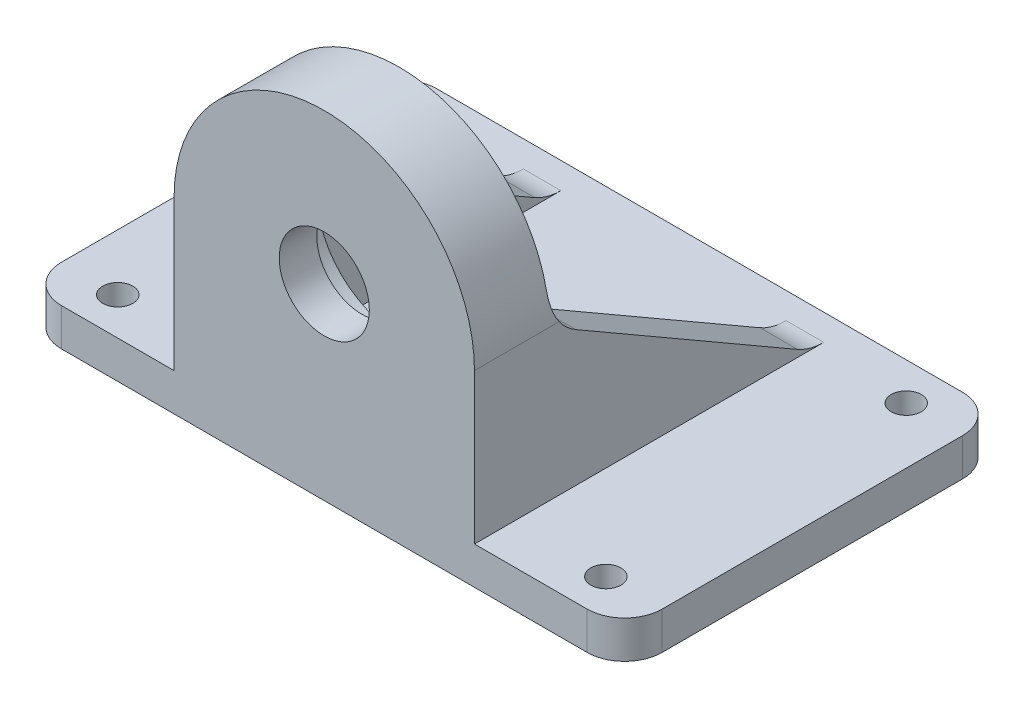
ISO-10303-21;
HEADER;
FILE_DESCRIPTION(('STEP AP214'),'2;1');
FILE_NAME('part.step','',(''),(''),'','','');
FILE_SCHEMA(('AUTOMOTIVE_DESIGN { 1 0 10303 214 1 1 1 1 }'));
ENDSEC;
DATA;
#1=APPLICATION_CONTEXT('core data for automotive mechanical design processes');
#2=APPLICATION_PROTOCOL_DEFINITION('international standard','automotive_design',2000,#1);
#3=PRODUCT_CONTEXT('',#1,'mechanical');
#4=PRODUCT('Part','Part','',(#3));
#5=PRODUCT_RELATED_PRODUCT_CATEGORY('part','',(#4));
#6=PRODUCT_DEFINITION_FORMATION('','',#4);
#7=PRODUCT_DEFINITION_CONTEXT('part definition',#1,'design');
#8=PRODUCT_DEFINITION('design','',#6,#7);
#9=PRODUCT_DEFINITION_SHAPE('','',#8);
#10=(LENGTH_UNIT() NAMED_UNIT(*) SI_UNIT(.MILLI.,.METRE.));
#11=(NAMED_UNIT(*) PLANE_ANGLE_UNIT() SI_UNIT($,.RADIAN.));
#12=(NAMED_UNIT(*) SI_UNIT($,.STERADIAN.) SOLID_ANGLE_UNIT());
#13=UNCERTAINTY_MEASURE_WITH_UNIT(LENGTH_MEASURE(1.E-05),#10,'distance_accuracy_value','');
#14=(GEOMETRIC_REPRESENTATION_CONTEXT(3) GLOBAL_UNCERTAINTY_ASSIGNED_CONTEXT((#13)) GLOBAL_UNIT_ASSIGNED_CONTEXT((#10,
#11,#12)) REPRESENTATION_CONTEXT('',''));
#15=CARTESIAN_POINT('',(0.,0.,0.));
#16=DIRECTION('',(0.,0.,1.));
#17=DIRECTION('',(1.,0.,0.));
#18=AXIS2_PLACEMENT_3D('',#15,#16,#17);
#19=CARTESIAN_POINT('',(0.,25.,15.));
#20=DIRECTION('',(0.,0.,1.));
#21=DIRECTION('',(1.,0.,0.));
#22=AXIS2_PLACEMENT_3D('',#19,#20,#21);
#23=PLANE('',#22);
#24=CARTESIAN_POINT('',(0.,25.,15.));
#25=DIRECTION('',(0.,0.,1.));
#26=DIRECTION('',(1.,0.,0.));
#27=AXIS2_PLACEMENT_3D('',#24,#25,#26);
#28=CIRCLE('',#27,11.);
#29=CARTESIAN_POINT('',(11.,25.,15.));
#30=VERTEX_POINT('',#29);
#31=EDGE_CURVE('E213',#30,#30,#28,.T.);
#32=ORIENTED_EDGE('',*,*,#31,.T.);
#33=EDGE_LOOP('',(#32));
#34=FACE_BOUND('',#33,.T.);
#35=DIRECTION('',(0.,1.,0.));
#36=VECTOR('',#35,1.);
#37=CARTESIAN_POINT('',(15.,5.,15.));
#38=LINE('',#37,#36);
#39=CARTESIAN_POINT('',(15.,12.,15.));
#40=VERTEX_POINT('',#39);
#41=CARTESIAN_POINT('',(15.,29.0414518843274,15.));
#42=VERTEX_POINT('',#41);
#43=EDGE_CURVE('E774',#40,#42,#38,.T.);
#44=ORIENTED_EDGE('',*,*,#43,.F.);
#45=DIRECTION('',(1.,0.,0.));
#46=VECTOR('',#45,1.);
#47=CARTESIAN_POINT('',(-15.,12.,15.));
#48=LINE('',#47,#46);
#49=CARTESIAN_POINT('',(-15.,12.,15.));
#50=VERTEX_POINT('',#49);
#51=EDGE_CURVE('E287',#40,#50,#48,.F.);
#52=ORIENTED_EDGE('',*,*,#51,.T.);
#53=DIRECTION('',(0.,1.,0.));
#54=VECTOR('',#53,1.);
#55=CARTESIAN_POINT('',(-15.,5.,15.));
#56=LINE('',#55,#54);
#57=CARTESIAN_POINT('',(-15.,29.0414518843274,15.));
#58=VERTEX_POINT('',#57);
#59=EDGE_CURVE('E518',#50,#58,#56,.T.);
#60=ORIENTED_EDGE('',*,*,#59,.T.);
#61=DIRECTION('',(-1.,0.,0.));
#62=VECTOR('',#61,1.);
#63=CARTESIAN_POINT('',(0.,29.0414518843274,15.));
#64=LINE('',#63,#62);
#65=CARTESIAN_POINT('',(-19.5874109230053,29.0414518843274,15.));
#66=VERTEX_POINT('',#65);
#67=EDGE_CURVE('E279',#58,#66,#64,.T.);
#68=ORIENTED_EDGE('',*,*,#67,.T.);
#69=CARTESIAN_POINT('',(0.,25.,15.));
#70=DIRECTION('',(0.,0.,1.));
#71=DIRECTION('',(1.,0.,0.));
#72=AXIS2_PLACEMENT_3D('',#69,#70,#71);
#73=CIRCLE('',#72,20.);
#74=CARTESIAN_POINT('',(19.5874109230053,29.0414518843274,15.));
#75=VERTEX_POINT('',#74);
#76=EDGE_CURVE('E196',#75,#66,#73,.T.);
#77=ORIENTED_EDGE('',*,*,#76,.F.);
#78=DIRECTION('',(1.,0.,0.));
#79=VECTOR('',#78,1.);
#80=CARTESIAN_POINT('',(15.,29.0414518843274,15.));
#81=LINE('',#80,#79);
#82=EDGE_CURVE('E283',#75,#42,#81,.F.);
#83=ORIENTED_EDGE('',*,*,#82,.T.);
#84=EDGE_LOOP('',(#44,#52,#60,#68,#77,#83));
#85=FACE_BOUND('',#84,.T.);
#86=ADVANCED_FACE('F39',(#34,#85),#23,.F.);
#87=CARTESIAN_POINT('',(0.,25.,15.));
#88=DIRECTION('',(0.,0.,1.));
#89=DIRECTION('',(1.,0.,0.));
#90=AXIS2_PLACEMENT_3D('',#87,#88,#89);
#91=CYLINDRICAL_SURFACE('',#90,11.);
#92=ORIENTED_EDGE('',*,*,#31,.F.);
#93=EDGE_LOOP('',(#92));
#94=FACE_BOUND('',#93,.T.);
#95=CARTESIAN_POINT('',(0.,25.,20.));
#96=DIRECTION('',(0.,0.,1.));
#97=DIRECTION('',(1.,0.,0.));
#98=AXIS2_PLACEMENT_3D('',#95,#96,#97);
#99=CIRCLE('',#98,11.);
#100=CARTESIAN_POINT('',(11.,25.,20.));
#101=VERTEX_POINT('',#100);
#102=EDGE_CURVE('E248',#101,#101,#99,.F.);
#103=ORIENTED_EDGE('',*,*,#102,.F.);
#104=EDGE_LOOP('',(#103));
#105=FACE_BOUND('',#104,.T.);
#106=ADVANCED_FACE('F374',(#94,#105),#91,.F.);
#107=CARTESIAN_POINT('',(0.,5.,0.));
#108=DIRECTION('',(0.,-1.,0.));
#109=DIRECTION('',(0.,0.,-1.));
#110=AXIS2_PLACEMENT_3D('',#107,#108,#109);
#111=PLANE('',#110);
#112=CARTESIAN_POINT('',(32.5,5.,20.));
#113=DIRECTION('',(0.,-1.,0.));
#114=DIRECTION('',(0.,0.,-1.));
#115=AXIS2_PLACEMENT_3D('',#112,#113,#114);
#116=CIRCLE('',#115,2.);
#117=CARTESIAN_POINT('',(32.5,5.,18.));
#118=VERTEX_POINT('',#117);
#119=EDGE_CURVE('E796',#118,#118,#116,.T.);
#120=ORIENTED_EDGE('',*,*,#119,.T.);
#121=EDGE_LOOP('',(#120));
#122=FACE_BOUND('',#121,.T.);
#123=CARTESIAN_POINT('',(32.5,5.,-20.));
#124=DIRECTION('',(0.,-1.,0.));
#125=DIRECTION('',(0.,0.,-1.));
#126=AXIS2_PLACEMENT_3D('',#123,#124,#125);
#127=CIRCLE('',#126,2.);
#128=CARTESIAN_POINT('',(32.5,5.,-22.));
#129=VERTEX_POINT('',#128);
#130=EDGE_CURVE('E804',#129,#129,#127,.T.);
#131=ORIENTED_EDGE('',*,*,#130,.T.);
#132=EDGE_LOOP('',(#131));
#133=FACE_BOUND('',#132,.T.);
#134=CARTESIAN_POINT('',(-32.5,5.,-20.));
#135=DIRECTION('',(0.,-1.,0.));
#136=DIRECTION('',(0.,0.,-1.));
#137=AXIS2_PLACEMENT_3D('',#134,#135,#136);
#138=CIRCLE('',#137,2.);
#139=CARTESIAN_POINT('',(-32.5,5.,-22.));
#140=VERTEX_POINT('',#139);
#141=EDGE_CURVE('E788',#140,#140,#138,.T.);
#142=ORIENTED_EDGE('',*,*,#141,.T.);
#143=EDGE_LOOP('',(#142));
#144=FACE_BOUND('',#143,.T.);
#145=CARTESIAN_POINT('',(-32.5,5.,20.));
#146=DIRECTION('',(0.,-1.,0.));
#147=DIRECTION('',(0.,0.,-1.));
#148=AXIS2_PLACEMENT_3D('',#145,#146,#147);
#149=CIRCLE('',#148,2.);
#150=CARTESIAN_POINT('',(-32.5,5.,18.));
#151=VERTEX_POINT('',#150);
#152=EDGE_CURVE('E780',#151,#151,#149,.T.);
#153=ORIENTED_EDGE('',*,*,#152,.T.);
#154=EDGE_LOOP('',(#153));
#155=FACE_BOUND('',#154,.T.);
#156=DIRECTION('',(1.,0.,0.));
#157=VECTOR('',#156,1.);
#158=CARTESIAN_POINT('',(-40.,5.,25.));
#159=LINE('',#158,#157);
#160=CARTESIAN_POINT('',(20.,5.,25.));
#161=VERTEX_POINT('',#160);
#162=CARTESIAN_POINT('',(35.,5.,25.));
#163=VERTEX_POINT('',#162);
#164=EDGE_CURVE('E244',#161,#163,#159,.T.);
#165=ORIENTED_EDGE('',*,*,#164,.T.);
#166=CARTESIAN_POINT('',(35.,5.,20.));
#167=DIRECTION('',(0.,-1.,0.));
#168=DIRECTION('',(0.,0.,-1.));
#169=AXIS2_PLACEMENT_3D('',#166,#167,#168);
#170=CIRCLE('',#169,5.);
#171=CARTESIAN_POINT('',(40.,5.,20.));
#172=VERTEX_POINT('',#171);
#173=EDGE_CURVE('E460',#163,#172,#170,.F.);
#174=ORIENTED_EDGE('',*,*,#173,.T.);
#175=DIRECTION('',(0.,0.,-1.));
#176=VECTOR('',#175,1.);
#177=CARTESIAN_POINT('',(40.,5.,25.));
#178=LINE('',#177,#176);
#179=CARTESIAN_POINT('',(40.,5.,-20.));
#180=VERTEX_POINT('',#179);
#181=EDGE_CURVE('E233',#172,#180,#178,.T.);
#182=ORIENTED_EDGE('',*,*,#181,.T.);
#183=CARTESIAN_POINT('',(35.,5.,-20.));
#184=DIRECTION('',(0.,-1.,0.));
#185=DIRECTION('',(0.,0.,-1.));
#186=AXIS2_PLACEMENT_3D('',#183,#184,#185);
#187=CIRCLE('',#186,5.);
#188=CARTESIAN_POINT('',(35.,5.,-25.));
#189=VERTEX_POINT('',#188);
#190=EDGE_CURVE('E452',#180,#189,#187,.F.);
#191=ORIENTED_EDGE('',*,*,#190,.T.);
#192=DIRECTION('',(-1.,0.,0.));
#193=VECTOR('',#192,1.);
#194=CARTESIAN_POINT('',(-40.,5.,-25.));
#195=LINE('',#194,#193);
#196=CARTESIAN_POINT('',(-35.,5.,-25.));
#197=VERTEX_POINT('',#196);
#198=EDGE_CURVE('E237',#189,#197,#195,.T.);
#199=ORIENTED_EDGE('',*,*,#198,.T.);
#200=CARTESIAN_POINT('',(-35.,5.,-20.));
#201=DIRECTION('',(0.,-1.,0.));
#202=DIRECTION('',(0.,0.,-1.));
#203=AXIS2_PLACEMENT_3D('',#200,#201,#202);
#204=CIRCLE('',#203,5.);
#205=CARTESIAN_POINT('',(-40.,5.,-20.));
#206=VERTEX_POINT('',#205);
#207=EDGE_CURVE('E62',#197,#206,#204,.F.);
#208=ORIENTED_EDGE('',*,*,#207,.T.);
#209=DIRECTION('',(0.,0.,1.));
#210=VECTOR('',#209,1.);
#211=CARTESIAN_POINT('',(-40.,5.,25.));
#212=LINE('',#211,#210);
#213=CARTESIAN_POINT('',(-40.,5.,20.));
#214=VERTEX_POINT('',#213);
#215=EDGE_CURVE('E241',#206,#214,#212,.T.);
#216=ORIENTED_EDGE('',*,*,#215,.T.);
#217=CARTESIAN_POINT('',(-35.,5.,20.));
#218=DIRECTION('',(0.,-1.,0.));
#219=DIRECTION('',(0.,0.,-1.));
#220=AXIS2_PLACEMENT_3D('',#217,#218,#219);
#221=CIRCLE('',#220,5.);
#222=CARTESIAN_POINT('',(-35.,5.,25.));
#223=VERTEX_POINT('',#222);
#224=EDGE_CURVE('E457',#214,#223,#221,.F.);
#225=ORIENTED_EDGE('',*,*,#224,.T.);
#226=CARTESIAN_POINT('',(-20.,5.,25.));
#227=VERTEX_POINT('',#226);
#228=EDGE_CURVE('E245',#223,#227,#159,.T.);
#229=ORIENTED_EDGE('',*,*,#228,.T.);
#230=DIRECTION('',(0.,0.,1.));
#231=VECTOR('',#230,1.);
#232=CARTESIAN_POINT('',(-20.,5.,15.));
#233=LINE('',#232,#231);
#234=CARTESIAN_POINT('',(-20.,5.,-21.5166604983959));
#235=VERTEX_POINT('',#234);
#236=EDGE_CURVE('E195',#235,#227,#233,.T.);
#237=ORIENTED_EDGE('',*,*,#236,.F.);
#238=DIRECTION('',(-1.,0.,0.));
#239=VECTOR('',#238,1.);
#240=CARTESIAN_POINT('',(0.,5.,-21.5166604983959));
#241=LINE('',#240,#239);
#242=CARTESIAN_POINT('',(-15.,5.,-21.5166604983959));
#243=VERTEX_POINT('',#242);
#244=EDGE_CURVE('E268',#235,#243,#241,.F.);
#245=ORIENTED_EDGE('',*,*,#244,.T.);
#246=DIRECTION('',(0.,0.,1.));
#247=VECTOR('',#246,1.);
#248=CARTESIAN_POINT('',(-15.,5.,-19.641016151378));
#249=LINE('',#248,#247);
#250=CARTESIAN_POINT('',(-15.,5.,7.99999999999999));
#251=VERTEX_POINT('',#250);
#252=EDGE_CURVE('E517',#243,#251,#249,.T.);
#253=ORIENTED_EDGE('',*,*,#252,.T.);
#254=DIRECTION('',(1.,0.,0.));
#255=VECTOR('',#254,1.);
#256=CARTESIAN_POINT('',(15.,5.,8.));
#257=LINE('',#256,#255);
#258=CARTESIAN_POINT('',(15.,5.,7.99999999999999));
#259=VERTEX_POINT('',#258);
#260=EDGE_CURVE('E272',#251,#259,#257,.T.);
#261=ORIENTED_EDGE('',*,*,#260,.T.);
#262=DIRECTION('',(0.,0.,1.));
#263=VECTOR('',#262,1.);
#264=CARTESIAN_POINT('',(15.,5.,-19.641016151378));
#265=LINE('',#264,#263);
#266=CARTESIAN_POINT('',(15.,5.,-21.5166604983959));
#267=VERTEX_POINT('',#266);
#268=EDGE_CURVE('E771',#267,#259,#265,.T.);
#269=ORIENTED_EDGE('',*,*,#268,.F.);
#270=DIRECTION('',(1.,0.,0.));
#271=VECTOR('',#270,1.);
#272=CARTESIAN_POINT('',(20.,5.,-21.5166604983959));
#273=LINE('',#272,#271);
#274=CARTESIAN_POINT('',(20.,5.,-21.5166604983959));
#275=VERTEX_POINT('',#274);
#276=EDGE_CURVE('E264',#267,#275,#273,.T.);
#277=ORIENTED_EDGE('',*,*,#276,.T.);
#278=DIRECTION('',(0.,0.,1.));
#279=VECTOR('',#278,1.);
#280=CARTESIAN_POINT('',(20.,5.,15.));
#281=LINE('',#280,#279);
#282=EDGE_CURVE('E227',#275,#161,#281,.T.);
#283=ORIENTED_EDGE('',*,*,#282,.T.);
#284=EDGE_LOOP('',(#165,#174,#182,#191,#199,#208,#216,#225,#229,#237,#245,#253,#261,#269,#277,#283));
#285=FACE_BOUND('',#284,.T.);
#286=ADVANCED_FACE('F333',(#122,#133,#144,#155,#285),#111,.F.);
#287=CARTESIAN_POINT('',(40.,5.,25.));
#288=DIRECTION('',(-1.,0.,0.));
#289=DIRECTION('',(0.,0.,1.));
#290=AXIS2_PLACEMENT_3D('',#287,#288,#289);
#291=PLANE('',#290);
#292=ORIENTED_EDGE('',*,*,#181,.F.);
#293=DIRECTION('',(0.,-1.,0.));
#294=VECTOR('',#293,1.);
#295=CARTESIAN_POINT('',(40.,5.,20.));
#296=LINE('',#295,#294);
#297=CARTESIAN_POINT('',(40.,0.,20.));
#298=VERTEX_POINT('',#297);
#299=EDGE_CURVE('E430',#172,#298,#296,.T.);
#300=ORIENTED_EDGE('',*,*,#299,.T.);
#301=DIRECTION('',(0.,0.,-1.));
#302=VECTOR('',#301,1.);
#303=CARTESIAN_POINT('',(40.,0.,25.));
#304=LINE('',#303,#302);
#305=CARTESIAN_POINT('',(40.,0.,-20.));
#306=VERTEX_POINT('',#305);
#307=EDGE_CURVE('E226',#298,#306,#304,.T.);
#308=ORIENTED_EDGE('',*,*,#307,.T.);
#309=DIRECTION('',(0.,-1.,0.));
#310=VECTOR('',#309,1.);
#311=CARTESIAN_POINT('',(40.,5.,-20.));
#312=LINE('',#311,#310);
#313=EDGE_CURVE('E427',#306,#180,#312,.F.);
#314=ORIENTED_EDGE('',*,*,#313,.T.);
#315=EDGE_LOOP('',(#292,#300,#308,#314));
#316=FACE_BOUND('',#315,.T.);
#317=ADVANCED_FACE('F489',(#316),#291,.F.);
#318=CARTESIAN_POINT('',(-40.,5.,-25.));
#319=DIRECTION('',(0.,0.,1.));
#320=DIRECTION('',(1.,0.,0.));
#321=AXIS2_PLACEMENT_3D('',#318,#319,#320);
#322=PLANE('',#321);
#323=DIRECTION('',(-1.,0.,0.));
#324=VECTOR('',#323,1.);
#325=CARTESIAN_POINT('',(-40.,0.,-25.));
#326=LINE('',#325,#324);
#327=CARTESIAN_POINT('',(35.,0.,-25.));
#328=VERTEX_POINT('',#327);
#329=CARTESIAN_POINT('',(-35.,0.,-25.));
#330=VERTEX_POINT('',#329);
#331=EDGE_CURVE('E252',#328,#330,#326,.T.);
#332=ORIENTED_EDGE('',*,*,#331,.T.);
#333=DIRECTION('',(0.,-1.,0.));
#334=VECTOR('',#333,1.);
#335=CARTESIAN_POINT('',(-35.,5.,-25.));
#336=LINE('',#335,#334);
#337=EDGE_CURVE('E11',#330,#197,#336,.F.);
#338=ORIENTED_EDGE('',*,*,#337,.T.);
#339=ORIENTED_EDGE('',*,*,#198,.F.);
#340=DIRECTION('',(0.,-1.,0.));
#341=VECTOR('',#340,1.);
#342=CARTESIAN_POINT('',(35.,5.,-25.));
#343=LINE('',#342,#341);
#344=EDGE_CURVE('E48',#189,#328,#343,.T.);
#345=ORIENTED_EDGE('',*,*,#344,.T.);
#346=EDGE_LOOP('',(#332,#338,#339,#345));
#347=FACE_BOUND('',#346,.T.);
#348=ADVANCED_FACE('F475',(#347),#322,.F.);
#349=CARTESIAN_POINT('',(-40.,5.,25.));
#350=DIRECTION('',(1.,0.,0.));
#351=DIRECTION('',(0.,0.,-1.));
#352=AXIS2_PLACEMENT_3D('',#349,#350,#351);
#353=PLANE('',#352);
#354=DIRECTION('',(0.,0.,1.));
#355=VECTOR('',#354,1.);
#356=CARTESIAN_POINT('',(-40.,0.,25.));
#357=LINE('',#356,#355);
#358=CARTESIAN_POINT('',(-40.,0.,-20.));
#359=VERTEX_POINT('',#358);
#360=CARTESIAN_POINT('',(-40.,0.,20.));
#361=VERTEX_POINT('',#360);
#362=EDGE_CURVE('E256',#359,#361,#357,.T.);
#363=ORIENTED_EDGE('',*,*,#362,.T.);
#364=DIRECTION('',(0.,-1.,0.));
#365=VECTOR('',#364,1.);
#366=CARTESIAN_POINT('',(-40.,5.,20.));
#367=LINE('',#366,#365);
#368=EDGE_CURVE('E55',#361,#214,#367,.F.);
#369=ORIENTED_EDGE('',*,*,#368,.T.);
#370=ORIENTED_EDGE('',*,*,#215,.F.);
#371=DIRECTION('',(0.,-1.,0.));
#372=VECTOR('',#371,1.);
#373=CARTESIAN_POINT('',(-40.,5.,-20.));
#374=LINE('',#373,#372);
#375=EDGE_CURVE('E463',#206,#359,#374,.T.);
#376=ORIENTED_EDGE('',*,*,#375,.T.);
#377=EDGE_LOOP('',(#363,#369,#370,#376));
#378=FACE_BOUND('',#377,.T.);
#379=ADVANCED_FACE('F482',(#378),#353,.F.);
#380=CARTESIAN_POINT('',(-40.,5.,25.));
#381=DIRECTION('',(0.,0.,-1.));
#382=DIRECTION('',(-1.,0.,0.));
#383=AXIS2_PLACEMENT_3D('',#380,#381,#382);
#384=PLANE('',#383);
#385=DIRECTION('',(1.,0.,0.));
#386=VECTOR('',#385,1.);
#387=CARTESIAN_POINT('',(-40.,0.,25.));
#388=LINE('',#387,#386);
#389=CARTESIAN_POINT('',(-35.,0.,25.));
#390=VERTEX_POINT('',#389);
#391=CARTESIAN_POINT('',(35.,0.,25.));
#392=VERTEX_POINT('',#391);
#393=EDGE_CURVE('E238',#390,#392,#388,.T.);
#394=ORIENTED_EDGE('',*,*,#393,.T.);
#395=DIRECTION('',(0.,-1.,0.));
#396=VECTOR('',#395,1.);
#397=CARTESIAN_POINT('',(35.,5.,25.));
#398=LINE('',#397,#396);
#399=EDGE_CURVE('E395',#392,#163,#398,.F.);
#400=ORIENTED_EDGE('',*,*,#399,.T.);
#401=ORIENTED_EDGE('',*,*,#164,.F.);
#402=DIRECTION('',(0.,1.,0.));
#403=VECTOR('',#402,1.);
#404=CARTESIAN_POINT('',(20.,5.,25.));
#405=LINE('',#404,#403);
#406=CARTESIAN_POINT('',(20.,25.,25.));
#407=VERTEX_POINT('',#406);
#408=EDGE_CURVE('E206',#161,#407,#405,.T.);
#409=ORIENTED_EDGE('',*,*,#408,.T.);
#410=CARTESIAN_POINT('',(0.,25.,25.));
#411=DIRECTION('',(0.,0.,1.));
#412=DIRECTION('',(1.,0.,0.));
#413=AXIS2_PLACEMENT_3D('',#410,#411,#412);
#414=CIRCLE('',#413,20.);
#415=CARTESIAN_POINT('',(-20.,25.,25.));
#416=VERTEX_POINT('',#415);
#417=EDGE_CURVE('E188',#407,#416,#414,.T.);
#418=ORIENTED_EDGE('',*,*,#417,.T.);
#419=DIRECTION('',(0.,-1.,0.));
#420=VECTOR('',#419,1.);
#421=CARTESIAN_POINT('',(-20.,25.,25.));
#422=LINE('',#421,#420);
#423=EDGE_CURVE('E200',#416,#227,#422,.T.);
#424=ORIENTED_EDGE('',*,*,#423,.T.);
#425=ORIENTED_EDGE('',*,*,#228,.F.);
#426=DIRECTION('',(0.,-1.,0.));
#427=VECTOR('',#426,1.);
#428=CARTESIAN_POINT('',(-35.,5.,25.));
#429=LINE('',#428,#427);
#430=EDGE_CURVE('E446',#223,#390,#429,.T.);
#431=ORIENTED_EDGE('',*,*,#430,.T.);
#432=EDGE_LOOP('',(#394,#400,#401,#409,#418,#424,#425,#431));
#433=FACE_BOUND('',#432,.T.);
#434=CARTESIAN_POINT('',(0.,25.,25.));
#435=DIRECTION('',(0.,0.,1.));
#436=DIRECTION('',(1.,0.,0.));
#437=AXIS2_PLACEMENT_3D('',#434,#435,#436);
#438=CIRCLE('',#437,6.);
#439=CARTESIAN_POINT('',(6.,25.,25.));
#440=VERTEX_POINT('',#439);
#441=EDGE_CURVE('E523',#440,#440,#438,.T.);
#442=ORIENTED_EDGE('',*,*,#441,.F.);
#443=EDGE_LOOP('',(#442));
#444=FACE_BOUND('',#443,.T.);
#445=ADVANCED_FACE('F209',(#433,#444),#384,.F.);
#446=CARTESIAN_POINT('',(0.,0.,0.));
#447=DIRECTION('',(0.,-1.,0.));
#448=DIRECTION('',(0.,0.,-1.));
#449=AXIS2_PLACEMENT_3D('',#446,#447,#448);
#450=PLANE('',#449);
#451=CARTESIAN_POINT('',(32.5,0.,20.));
#452=DIRECTION('',(0.,-1.,0.));
#453=DIRECTION('',(0.,0.,-1.));
#454=AXIS2_PLACEMENT_3D('',#451,#452,#453);
#455=CIRCLE('',#454,2.);
#456=CARTESIAN_POINT('',(32.5,0.,18.));
#457=VERTEX_POINT('',#456);
#458=EDGE_CURVE('E792',#457,#457,#455,.T.);
#459=ORIENTED_EDGE('',*,*,#458,.F.);
#460=EDGE_LOOP('',(#459));
#461=FACE_BOUND('',#460,.T.);
#462=CARTESIAN_POINT('',(32.5,0.,-20.));
#463=DIRECTION('',(0.,-1.,0.));
#464=DIRECTION('',(0.,0.,-1.));
#465=AXIS2_PLACEMENT_3D('',#462,#463,#464);
#466=CIRCLE('',#465,2.);
#467=CARTESIAN_POINT('',(32.5,0.,-22.));
#468=VERTEX_POINT('',#467);
#469=EDGE_CURVE('E800',#468,#468,#466,.T.);
#470=ORIENTED_EDGE('',*,*,#469,.F.);
#471=EDGE_LOOP('',(#470));
#472=FACE_BOUND('',#471,.T.);
#473=CARTESIAN_POINT('',(-32.5,0.,-20.));
#474=DIRECTION('',(0.,-1.,0.));
#475=DIRECTION('',(0.,0.,-1.));
#476=AXIS2_PLACEMENT_3D('',#473,#474,#475);
#477=CIRCLE('',#476,2.);
#478=CARTESIAN_POINT('',(-32.5,0.,-22.));
#479=VERTEX_POINT('',#478);
#480=EDGE_CURVE('E808',#479,#479,#477,.T.);
#481=ORIENTED_EDGE('',*,*,#480,.F.);
#482=EDGE_LOOP('',(#481));
#483=FACE_BOUND('',#482,.T.);
#484=CARTESIAN_POINT('',(-32.5,0.,20.));
#485=DIRECTION('',(0.,-1.,0.));
#486=DIRECTION('',(0.,0.,-1.));
#487=AXIS2_PLACEMENT_3D('',#484,#485,#486);
#488=CIRCLE('',#487,2.);
#489=CARTESIAN_POINT('',(-32.5,0.,18.));
#490=VERTEX_POINT('',#489);
#491=EDGE_CURVE('E784',#490,#490,#488,.T.);
#492=ORIENTED_EDGE('',*,*,#491,.F.);
#493=EDGE_LOOP('',(#492));
#494=FACE_BOUND('',#493,.T.);
#495=ORIENTED_EDGE('',*,*,#307,.F.);
#496=CARTESIAN_POINT('',(35.,0.,20.));
#497=DIRECTION('',(0.,-1.,0.));
#498=DIRECTION('',(0.,0.,-1.));
#499=AXIS2_PLACEMENT_3D('',#496,#497,#498);
#500=CIRCLE('',#499,5.);
#501=EDGE_CURVE('E443',#298,#392,#500,.T.);
#502=ORIENTED_EDGE('',*,*,#501,.T.);
#503=ORIENTED_EDGE('',*,*,#393,.F.);
#504=CARTESIAN_POINT('',(-35.,0.,20.));
#505=DIRECTION('',(0.,-1.,0.));
#506=DIRECTION('',(0.,0.,-1.));
#507=AXIS2_PLACEMENT_3D('',#504,#505,#506);
#508=CIRCLE('',#507,5.);
#509=EDGE_CURVE('E440',#390,#361,#508,.T.);
#510=ORIENTED_EDGE('',*,*,#509,.T.);
#511=ORIENTED_EDGE('',*,*,#362,.F.);
#512=CARTESIAN_POINT('',(-35.,0.,-20.));
#513=DIRECTION('',(0.,-1.,0.));
#514=DIRECTION('',(0.,0.,-1.));
#515=AXIS2_PLACEMENT_3D('',#512,#513,#514);
#516=CIRCLE('',#515,5.);
#517=EDGE_CURVE('E437',#359,#330,#516,.T.);
#518=ORIENTED_EDGE('',*,*,#517,.T.);
#519=ORIENTED_EDGE('',*,*,#331,.F.);
#520=CARTESIAN_POINT('',(35.,0.,-20.));
#521=DIRECTION('',(0.,-1.,0.));
#522=DIRECTION('',(0.,0.,-1.));
#523=AXIS2_PLACEMENT_3D('',#520,#521,#522);
#524=CIRCLE('',#523,5.);
#525=EDGE_CURVE('E434',#328,#306,#524,.T.);
#526=ORIENTED_EDGE('',*,*,#525,.T.);
#527=EDGE_LOOP('',(#495,#502,#503,#510,#511,#518,#519,#526));
#528=FACE_BOUND('',#527,.T.);
#529=ADVANCED_FACE('F331',(#461,#472,#483,#494,#528),#450,.T.);
#530=CARTESIAN_POINT('',(0.,25.,15.));
#531=DIRECTION('',(0.,0.,1.));
#532=DIRECTION('',(1.,0.,0.));
#533=AXIS2_PLACEMENT_3D('',#530,#531,#532);
#534=CYLINDRICAL_SURFACE('',#533,20.);
#535=ORIENTED_EDGE('',*,*,#417,.F.);
#536=DIRECTION('',(0.,0.,1.));
#537=VECTOR('',#536,1.);
#538=CARTESIAN_POINT('',(20.,25.,15.));
#539=LINE('',#538,#537);
#540=CARTESIAN_POINT('',(20.,25.,13.7154760664941));
#541=VERTEX_POINT('',#540);
#542=EDGE_CURVE('E223',#541,#407,#539,.T.);
#543=ORIENTED_EDGE('',*,*,#542,.F.);
#544=CARTESIAN_POINT('',(20.,25.,13.7154760664941));
#545=CARTESIAN_POINT('',(20.0000152174634,25.1561626876305,13.8259316946152));
#546=CARTESIAN_POINT('',(19.9981718918568,25.3168907451518,13.9299509173076));
#547=CARTESIAN_POINT('',(19.9902308627008,25.6462526180296,14.1244678471015));
#548=CARTESIAN_POINT('',(19.9841326977325,25.8148872889738,14.2149640864014));
#549=CARTESIAN_POINT('',(19.9673702825056,26.1542313990605,14.3795448899929));
#550=CARTESIAN_POINT('',(19.9568317342347,26.324766489875,14.4540018056451));
#551=CARTESIAN_POINT('',(19.9308374778194,26.6708711448716,14.5889933751861));
#552=CARTESIAN_POINT('',(19.9153825825629,26.8464398724092,14.649530327807));
#553=CARTESIAN_POINT('',(19.8808108636214,27.1863275510531,14.7518367542417));
#554=CARTESIAN_POINT('',(19.8621138940051,27.3503433001626,14.7947599253256));
#555=CARTESIAN_POINT('',(19.8202556567171,27.6805161533003,14.8685129438769));
#556=CARTESIAN_POINT('',(19.7970942934893,27.846673303092,14.8993425324496));
#557=CARTESIAN_POINT('',(19.7456385896743,28.1842711765923,14.9494653583606));
#558=CARTESIAN_POINT('',(19.7172304390327,28.3557401707265,14.968451045175));
#559=CARTESIAN_POINT('',(19.6557767240048,28.6987836926171,14.9937276806347));
#560=CARTESIAN_POINT('',(19.6227311735846,28.8703582200541,15.0000186675106));
#561=CARTESIAN_POINT('',(19.5874109230053,29.0414518843274,15.));
#562=B_SPLINE_CURVE_WITH_KNOTS('',3,(#544,#545,#546,#547,#548,#549,#550,#551,#552,#553,#554,
#555,#556,#557,#558,#559,#560,#561),.UNSPECIFIED.,.F.,.F.,(4,2,2,2,2,2,2,2,4),(0.,
0.573681685934583,1.14742559483869,1.70591621013019,2.26431453036566,2.77552202463267,
3.28674046203659,3.81073440555738,4.33472677104135),.UNSPECIFIED.);
#563=EDGE_CURVE('E311',#541,#75,#562,.T.);
#564=ORIENTED_EDGE('',*,*,#563,.T.);
#565=ORIENTED_EDGE('',*,*,#76,.T.);
#566=CARTESIAN_POINT('',(-19.5874109230053,29.0414518843274,15.));
#567=CARTESIAN_POINT('',(-19.6260942382502,28.8540992333682,15.0000274743761));
#568=CARTESIAN_POINT('',(-19.6620418077043,28.6661653639539,14.9924791592841));
#569=CARTESIAN_POINT('',(-19.7283688883689,28.2905253101119,14.9621488919202));
#570=CARTESIAN_POINT('',(-19.7587477978742,28.1028191524631,14.9393652946792));
#571=CARTESIAN_POINT('',(-19.8131005999039,27.7340323378823,14.8792914064498));
#572=CARTESIAN_POINT('',(-19.8372232607723,27.5529081787759,14.8424027526038));
#573=CARTESIAN_POINT('',(-19.8801634248644,27.1935847236477,14.754227805595));
#574=CARTESIAN_POINT('',(-19.8989817974765,27.0153849528246,14.7029438746134));
#575=CARTESIAN_POINT('',(-19.9301280493429,26.6781541295734,14.5911797907757));
#576=CARTESIAN_POINT('',(-19.9428710607701,26.5187792193617,14.5318485987243));
#577=CARTESIAN_POINT('',(-19.9643155814564,26.2045375641221,14.4016284027818));
#578=CARTESIAN_POINT('',(-19.973017011988,26.0496709069671,14.3307391737837));
#579=CARTESIAN_POINT('',(-19.9868553784052,25.7415889327285,14.1758684386219));
#580=CARTESIAN_POINT('',(-19.9918977910115,25.5885116262631,14.0916039969043));
#581=CARTESIAN_POINT('',(-19.9984752237274,25.2890225068306,13.9118391930872));
#582=CARTESIAN_POINT('',(-20.000010232963,25.1426107145302,13.8163387961532));
#583=CARTESIAN_POINT('',(-20.,25.,13.7154760664941));
#584=B_SPLINE_CURVE_WITH_KNOTS('',3,(#566,#567,#568,#569,#570,#571,#572,#573,#574,#575,#576,
#577,#578,#579,#580,#581,#582,#583),.UNSPECIFIED.,.F.,.F.,(4,2,2,2,2,2,2,2,4),(0.,
0.57376949335971,1.14760094720643,1.70618168810253,2.26467082268106,2.77578958011891,
3.28691829341307,3.81082171253615,4.33472675593795),.UNSPECIFIED.);
#585=CARTESIAN_POINT('',(-20.,25.,13.7154760664941));
#586=VERTEX_POINT('',#585);
#587=EDGE_CURVE('E191',#66,#586,#584,.T.);
#588=ORIENTED_EDGE('',*,*,#587,.T.);
#589=DIRECTION('',(0.,0.,1.));
#590=VECTOR('',#589,1.);
#591=CARTESIAN_POINT('',(-20.,25.,15.));
#592=LINE('',#591,#590);
#593=EDGE_CURVE('E184',#586,#416,#592,.T.);
#594=ORIENTED_EDGE('',*,*,#593,.T.);
#595=EDGE_LOOP('',(#535,#543,#564,#565,#588,#594));
#596=FACE_BOUND('',#595,.T.);
#597=ADVANCED_FACE('F186',(#596),#534,.T.);
#598=CARTESIAN_POINT('',(20.,5.,15.));
#599=DIRECTION('',(1.,0.,0.));
#600=DIRECTION('',(0.,0.,-1.));
#601=AXIS2_PLACEMENT_3D('',#598,#599,#600);
#602=PLANE('',#601);
#603=ORIENTED_EDGE('',*,*,#408,.F.);
#604=ORIENTED_EDGE('',*,*,#282,.F.);
#605=CARTESIAN_POINT('',(20.,12.,-21.5166604983959));
#606=DIRECTION('',(1.,0.,0.));
#607=DIRECTION('',(0.,0.,-1.));
#608=AXIS2_PLACEMENT_3D('',#605,#606,#607);
#609=CIRCLE('',#608,7.);
#610=CARTESIAN_POINT('',(20.,5.93782217350891,-18.0166604983959));
#611=VERTEX_POINT('',#610);
#612=EDGE_CURVE('E420',#275,#611,#609,.F.);
#613=ORIENTED_EDGE('',*,*,#612,.T.);
#614=DIRECTION('',(0.,-0.499999999999995,-0.866025403784442));
#615=VECTOR('',#614,1.);
#616=CARTESIAN_POINT('',(20.,25.,15.));
#617=LINE('',#616,#615);
#618=CARTESIAN_POINT('',(20.,22.9792740578363,11.5));
#619=VERTEX_POINT('',#618);
#620=EDGE_CURVE('E778',#619,#611,#617,.T.);
#621=ORIENTED_EDGE('',*,*,#620,.F.);
#622=CARTESIAN_POINT('',(20.,29.0414518843274,8.));
#623=DIRECTION('',(1.,0.,0.));
#624=DIRECTION('',(0.,0.,-1.));
#625=AXIS2_PLACEMENT_3D('',#622,#623,#624);
#626=CIRCLE('',#625,7.);
#627=EDGE_CURVE('E307',#619,#541,#626,.F.);
#628=ORIENTED_EDGE('',*,*,#627,.T.);
#629=ORIENTED_EDGE('',*,*,#542,.T.);
#630=EDGE_LOOP('',(#603,#604,#613,#621,#628,#629));
#631=FACE_BOUND('',#630,.T.);
#632=ADVANCED_FACE('F330',(#631),#602,.T.);
#633=CARTESIAN_POINT('',(-20.,25.,15.));
#634=DIRECTION('',(-1.,0.,0.));
#635=DIRECTION('',(0.,0.,1.));
#636=AXIS2_PLACEMENT_3D('',#633,#634,#635);
#637=PLANE('',#636);
#638=ORIENTED_EDGE('',*,*,#423,.F.);
#639=ORIENTED_EDGE('',*,*,#593,.F.);
#640=CARTESIAN_POINT('',(-20.,29.0414518843274,8.));
#641=DIRECTION('',(-1.,0.,0.));
#642=DIRECTION('',(0.,0.,1.));
#643=AXIS2_PLACEMENT_3D('',#640,#641,#642);
#644=CIRCLE('',#643,7.);
#645=CARTESIAN_POINT('',(-20.,22.9792740578363,11.5));
#646=VERTEX_POINT('',#645);
#647=EDGE_CURVE('E342',#586,#646,#644,.F.);
#648=ORIENTED_EDGE('',*,*,#647,.T.);
#649=DIRECTION('',(0.,-0.499999999999995,-0.866025403784442));
#650=VECTOR('',#649,1.);
#651=CARTESIAN_POINT('',(-20.,25.,15.));
#652=LINE('',#651,#650);
#653=CARTESIAN_POINT('',(-20.,5.93782217350891,-18.0166604983959));
#654=VERTEX_POINT('',#653);
#655=EDGE_CURVE('E534',#646,#654,#652,.T.);
#656=ORIENTED_EDGE('',*,*,#655,.T.);
#657=CARTESIAN_POINT('',(-20.,12.,-21.5166604983959));
#658=DIRECTION('',(-1.,0.,0.));
#659=DIRECTION('',(0.,0.,1.));
#660=AXIS2_PLACEMENT_3D('',#657,#658,#659);
#661=CIRCLE('',#660,7.);
#662=EDGE_CURVE('E415',#654,#235,#661,.F.);
#663=ORIENTED_EDGE('',*,*,#662,.T.);
#664=ORIENTED_EDGE('',*,*,#236,.T.);
#665=EDGE_LOOP('',(#638,#639,#648,#656,#663,#664));
#666=FACE_BOUND('',#665,.T.);
#667=ADVANCED_FACE('F201',(#666),#637,.T.);
#668=CARTESIAN_POINT('',(0.,25.,20.));
#669=DIRECTION('',(0.,0.,1.));
#670=DIRECTION('',(1.,0.,0.));
#671=AXIS2_PLACEMENT_3D('',#668,#669,#670);
#672=PLANE('',#671);
#673=CARTESIAN_POINT('',(0.,25.,20.));
#674=DIRECTION('',(0.,0.,1.));
#675=DIRECTION('',(1.,0.,0.));
#676=AXIS2_PLACEMENT_3D('',#673,#674,#675);
#677=CIRCLE('',#676,6.);
#678=CARTESIAN_POINT('',(6.,25.,20.));
#679=VERTEX_POINT('',#678);
#680=EDGE_CURVE('E217',#679,#679,#677,.T.);
#681=ORIENTED_EDGE('',*,*,#680,.T.);
#682=EDGE_LOOP('',(#681));
#683=FACE_BOUND('',#682,.T.);
#684=ORIENTED_EDGE('',*,*,#102,.T.);
#685=EDGE_LOOP('',(#684));
#686=FACE_BOUND('',#685,.T.);
#687=ADVANCED_FACE('F389',(#683,#686),#672,.F.);
#688=CARTESIAN_POINT('',(0.,25.,20.));
#689=DIRECTION('',(0.,0.,1.));
#690=DIRECTION('',(1.,0.,0.));
#691=AXIS2_PLACEMENT_3D('',#688,#689,#690);
#692=CYLINDRICAL_SURFACE('',#691,6.);
#693=ORIENTED_EDGE('',*,*,#680,.F.);
#694=EDGE_LOOP('',(#693));
#695=FACE_BOUND('',#694,.T.);
#696=ORIENTED_EDGE('',*,*,#441,.T.);
#697=EDGE_LOOP('',(#696));
#698=FACE_BOUND('',#697,.T.);
#699=ADVANCED_FACE('F545',(#695,#698),#692,.F.);
#700=CARTESIAN_POINT('',(-15.,25.,15.));
#701=DIRECTION('',(0.,0.866025403784442,-0.499999999999995));
#702=DIRECTION('',(0.,0.499999999999995,0.866025403784442));
#703=AXIS2_PLACEMENT_3D('',#700,#701,#702);
#704=PLANE('',#703);
#705=ORIENTED_EDGE('',*,*,#655,.F.);
#706=DIRECTION('',(-1.,0.,0.));
#707=VECTOR('',#706,1.);
#708=CARTESIAN_POINT('',(-15.,22.9792740578363,11.5));
#709=LINE('',#708,#707);
#710=CARTESIAN_POINT('',(-15.,22.9792740578363,11.5));
#711=VERTEX_POINT('',#710);
#712=EDGE_CURVE('E304',#646,#711,#709,.F.);
#713=ORIENTED_EDGE('',*,*,#712,.T.);
#714=DIRECTION('',(0.,-0.499999999999995,-0.866025403784442));
#715=VECTOR('',#714,1.);
#716=CARTESIAN_POINT('',(-15.,25.,15.));
#717=LINE('',#716,#715);
#718=CARTESIAN_POINT('',(-15.,5.93782217350891,-18.0166604983959));
#719=VERTEX_POINT('',#718);
#720=EDGE_CURVE('E524',#711,#719,#717,.T.);
#721=ORIENTED_EDGE('',*,*,#720,.T.);
#722=DIRECTION('',(-1.,0.,0.));
#723=VECTOR('',#722,1.);
#724=CARTESIAN_POINT('',(-15.,5.93782217350891,-18.0166604983959));
#725=LINE('',#724,#723);
#726=EDGE_CURVE('E300',#719,#654,#725,.T.);
#727=ORIENTED_EDGE('',*,*,#726,.T.);
#728=EDGE_LOOP('',(#705,#713,#721,#727));
#729=FACE_BOUND('',#728,.T.);
#730=ADVANCED_FACE('F548',(#729),#704,.T.);
#731=CARTESIAN_POINT('',(-15.,0.,0.));
#732=DIRECTION('',(1.,0.,0.));
#733=DIRECTION('',(0.,0.,-1.));
#734=AXIS2_PLACEMENT_3D('',#731,#732,#733);
#735=PLANE('',#734);
#736=ORIENTED_EDGE('',*,*,#59,.F.);
#737=CARTESIAN_POINT('',(-15.,12.,8.));
#738=DIRECTION('',(1.,0.,0.));
#739=DIRECTION('',(0.,0.,-1.));
#740=AXIS2_PLACEMENT_3D('',#737,#738,#739);
#741=CIRCLE('',#740,7.);
#742=EDGE_CURVE('E290',#50,#251,#741,.T.);
#743=ORIENTED_EDGE('',*,*,#742,.T.);
#744=ORIENTED_EDGE('',*,*,#252,.F.);
#745=CARTESIAN_POINT('',(-15.,12.,-21.5166604983959));
#746=DIRECTION('',(1.,0.,0.));
#747=DIRECTION('',(0.,0.,-1.));
#748=AXIS2_PLACEMENT_3D('',#745,#746,#747);
#749=CIRCLE('',#748,7.);
#750=EDGE_CURVE('E417',#243,#719,#749,.F.);
#751=ORIENTED_EDGE('',*,*,#750,.T.);
#752=ORIENTED_EDGE('',*,*,#720,.F.);
#753=CARTESIAN_POINT('',(-15.,29.0414518843274,8.));
#754=DIRECTION('',(1.,0.,0.));
#755=DIRECTION('',(0.,0.,-1.));
#756=AXIS2_PLACEMENT_3D('',#753,#754,#755);
#757=CIRCLE('',#756,7.);
#758=EDGE_CURVE('E412',#711,#58,#757,.F.);
#759=ORIENTED_EDGE('',*,*,#758,.T.);
#760=EDGE_LOOP('',(#736,#743,#744,#751,#752,#759));
#761=FACE_BOUND('',#760,.T.);
#762=ADVANCED_FACE('F516',(#761),#735,.T.);
#763=CARTESIAN_POINT('',(15.,25.,15.));
#764=DIRECTION('',(0.,-0.866025403784442,0.499999999999995));
#765=DIRECTION('',(0.,-0.499999999999995,-0.866025403784442));
#766=AXIS2_PLACEMENT_3D('',#763,#764,#765);
#767=PLANE('',#766);
#768=DIRECTION('',(0.,-0.499999999999995,-0.866025403784442));
#769=VECTOR('',#768,1.);
#770=CARTESIAN_POINT('',(15.,25.,15.));
#771=LINE('',#770,#769);
#772=CARTESIAN_POINT('',(15.,22.9792740578363,11.5));
#773=VERTEX_POINT('',#772);
#774=CARTESIAN_POINT('',(15.,5.93782217350891,-18.0166604983959));
#775=VERTEX_POINT('',#774);
#776=EDGE_CURVE('E538',#773,#775,#771,.T.);
#777=ORIENTED_EDGE('',*,*,#776,.F.);
#778=DIRECTION('',(1.,0.,0.));
#779=VECTOR('',#778,1.);
#780=CARTESIAN_POINT('',(20.,22.9792740578363,11.5));
#781=LINE('',#780,#779);
#782=EDGE_CURVE('E296',#773,#619,#781,.T.);
#783=ORIENTED_EDGE('',*,*,#782,.T.);
#784=ORIENTED_EDGE('',*,*,#620,.T.);
#785=DIRECTION('',(1.,0.,0.));
#786=VECTOR('',#785,1.);
#787=CARTESIAN_POINT('',(15.,5.93782217350891,-18.0166604983959));
#788=LINE('',#787,#786);
#789=EDGE_CURVE('E293',#611,#775,#788,.F.);
#790=ORIENTED_EDGE('',*,*,#789,.T.);
#791=EDGE_LOOP('',(#777,#783,#784,#790));
#792=FACE_BOUND('',#791,.T.);
#793=ADVANCED_FACE('F508',(#792),#767,.F.);
#794=CARTESIAN_POINT('',(15.,0.,0.));
#795=DIRECTION('',(-1.,0.,0.));
#796=DIRECTION('',(0.,0.,-1.));
#797=AXIS2_PLACEMENT_3D('',#794,#795,#796);
#798=PLANE('',#797);
#799=ORIENTED_EDGE('',*,*,#268,.T.);
#800=CARTESIAN_POINT('',(15.,12.,8.));
#801=DIRECTION('',(-1.,0.,0.));
#802=DIRECTION('',(0.,0.,1.));
#803=AXIS2_PLACEMENT_3D('',#800,#801,#802);
#804=CIRCLE('',#803,7.);
#805=EDGE_CURVE('E276',#259,#40,#804,.T.);
#806=ORIENTED_EDGE('',*,*,#805,.T.);
#807=ORIENTED_EDGE('',*,*,#43,.T.);
#808=CARTESIAN_POINT('',(15.,29.0414518843274,8.));
#809=DIRECTION('',(-1.,0.,0.));
#810=DIRECTION('',(0.,0.,1.));
#811=AXIS2_PLACEMENT_3D('',#808,#809,#810);
#812=CIRCLE('',#811,7.);
#813=EDGE_CURVE('E320',#42,#773,#812,.F.);
#814=ORIENTED_EDGE('',*,*,#813,.T.);
#815=ORIENTED_EDGE('',*,*,#776,.T.);
#816=CARTESIAN_POINT('',(15.,12.,-21.5166604983959));
#817=DIRECTION('',(-1.,0.,0.));
#818=DIRECTION('',(0.,0.,1.));
#819=AXIS2_PLACEMENT_3D('',#816,#817,#818);
#820=CIRCLE('',#819,7.);
#821=EDGE_CURVE('E423',#775,#267,#820,.F.);
#822=ORIENTED_EDGE('',*,*,#821,.T.);
#823=EDGE_LOOP('',(#799,#806,#807,#814,#815,#822));
#824=FACE_BOUND('',#823,.T.);
#825=ADVANCED_FACE('F502',(#824),#798,.T.);
#826=CARTESIAN_POINT('',(0.,12.,8.));
#827=DIRECTION('',(-1.,0.,0.));
#828=DIRECTION('',(0.,0.,1.));
#829=AXIS2_PLACEMENT_3D('',#826,#827,#828);
#830=CYLINDRICAL_SURFACE('',#829,7.);
#831=ORIENTED_EDGE('',*,*,#742,.F.);
#832=ORIENTED_EDGE('',*,*,#51,.F.);
#833=ORIENTED_EDGE('',*,*,#805,.F.);
#834=ORIENTED_EDGE('',*,*,#260,.F.);
#835=EDGE_LOOP('',(#831,#832,#833,#834));
#836=FACE_BOUND('',#835,.T.);
#837=ADVANCED_FACE('F500',(#836),#830,.F.);
#838=CARTESIAN_POINT('',(15.,29.0414518843274,8.));
#839=DIRECTION('',(-1.,0.,0.));
#840=DIRECTION('',(0.,0.,1.));
#841=AXIS2_PLACEMENT_3D('',#838,#839,#840);
#842=CYLINDRICAL_SURFACE('',#841,7.);
#843=ORIENTED_EDGE('',*,*,#813,.F.);
#844=ORIENTED_EDGE('',*,*,#82,.F.);
#845=ORIENTED_EDGE('',*,*,#563,.F.);
#846=ORIENTED_EDGE('',*,*,#627,.F.);
#847=ORIENTED_EDGE('',*,*,#782,.F.);
#848=EDGE_LOOP('',(#843,#844,#845,#846,#847));
#849=FACE_BOUND('',#848,.T.);
#850=ADVANCED_FACE('F322',(#849),#842,.F.);
#851=CARTESIAN_POINT('',(0.,29.0414518843274,8.));
#852=DIRECTION('',(-1.,0.,0.));
#853=DIRECTION('',(0.,0.,1.));
#854=AXIS2_PLACEMENT_3D('',#851,#852,#853);
#855=CYLINDRICAL_SURFACE('',#854,7.);
#856=ORIENTED_EDGE('',*,*,#758,.F.);
#857=ORIENTED_EDGE('',*,*,#712,.F.);
#858=ORIENTED_EDGE('',*,*,#647,.F.);
#859=ORIENTED_EDGE('',*,*,#587,.F.);
#860=ORIENTED_EDGE('',*,*,#67,.F.);
#861=EDGE_LOOP('',(#856,#857,#858,#859,#860));
#862=FACE_BOUND('',#861,.T.);
#863=ADVANCED_FACE('F344',(#862),#855,.F.);
#864=CARTESIAN_POINT('',(-15.,12.,-21.5166604983959));
#865=DIRECTION('',(-1.,0.,0.));
#866=DIRECTION('',(0.,0.,1.));
#867=AXIS2_PLACEMENT_3D('',#864,#865,#866);
#868=CYLINDRICAL_SURFACE('',#867,7.);
#869=ORIENTED_EDGE('',*,*,#750,.F.);
#870=ORIENTED_EDGE('',*,*,#244,.F.);
#871=ORIENTED_EDGE('',*,*,#662,.F.);
#872=ORIENTED_EDGE('',*,*,#726,.F.);
#873=EDGE_LOOP('',(#869,#870,#871,#872));
#874=FACE_BOUND('',#873,.T.);
#875=ADVANCED_FACE('F348',(#874),#868,.F.);
#876=CARTESIAN_POINT('',(0.,12.,-21.5166604983959));
#877=DIRECTION('',(-1.,0.,0.));
#878=DIRECTION('',(0.,0.,1.));
#879=AXIS2_PLACEMENT_3D('',#876,#877,#878);
#880=CYLINDRICAL_SURFACE('',#879,7.);
#881=ORIENTED_EDGE('',*,*,#821,.F.);
#882=ORIENTED_EDGE('',*,*,#789,.F.);
#883=ORIENTED_EDGE('',*,*,#612,.F.);
#884=ORIENTED_EDGE('',*,*,#276,.F.);
#885=EDGE_LOOP('',(#881,#882,#883,#884));
#886=FACE_BOUND('',#885,.T.);
#887=ADVANCED_FACE('F352',(#886),#880,.F.);
#888=CARTESIAN_POINT('',(-32.5,5.,20.));
#889=DIRECTION('',(0.,-1.,0.));
#890=DIRECTION('',(0.,0.,-1.));
#891=AXIS2_PLACEMENT_3D('',#888,#889,#890);
#892=CYLINDRICAL_SURFACE('',#891,2.);
#893=ORIENTED_EDGE('',*,*,#152,.F.);
#894=EDGE_LOOP('',(#893));
#895=FACE_BOUND('',#894,.T.);
#896=ORIENTED_EDGE('',*,*,#491,.T.);
#897=EDGE_LOOP('',(#896));
#898=FACE_BOUND('',#897,.T.);
#899=ADVANCED_FACE('F356',(#895,#898),#892,.F.);
#900=CARTESIAN_POINT('',(-32.5,5.,-20.));
#901=DIRECTION('',(0.,-1.,0.));
#902=DIRECTION('',(0.,0.,-1.));
#903=AXIS2_PLACEMENT_3D('',#900,#901,#902);
#904=CYLINDRICAL_SURFACE('',#903,2.);
#905=ORIENTED_EDGE('',*,*,#141,.F.);
#906=EDGE_LOOP('',(#905));
#907=FACE_BOUND('',#906,.T.);
#908=ORIENTED_EDGE('',*,*,#480,.T.);
#909=EDGE_LOOP('',(#908));
#910=FACE_BOUND('',#909,.T.);
#911=ADVANCED_FACE('F596',(#907,#910),#904,.F.);
#912=CARTESIAN_POINT('',(32.5,5.,-20.));
#913=DIRECTION('',(0.,-1.,0.));
#914=DIRECTION('',(0.,0.,-1.));
#915=AXIS2_PLACEMENT_3D('',#912,#913,#914);
#916=CYLINDRICAL_SURFACE('',#915,2.);
#917=ORIENTED_EDGE('',*,*,#130,.F.);
#918=EDGE_LOOP('',(#917));
#919=FACE_BOUND('',#918,.T.);
#920=ORIENTED_EDGE('',*,*,#469,.T.);
#921=EDGE_LOOP('',(#920));
#922=FACE_BOUND('',#921,.T.);
#923=ADVANCED_FACE('F585',(#919,#922),#916,.F.);
#924=CARTESIAN_POINT('',(32.5,5.,20.));
#925=DIRECTION('',(0.,-1.,0.));
#926=DIRECTION('',(0.,0.,-1.));
#927=AXIS2_PLACEMENT_3D('',#924,#925,#926);
#928=CYLINDRICAL_SURFACE('',#927,2.);
#929=ORIENTED_EDGE('',*,*,#119,.F.);
#930=EDGE_LOOP('',(#929));
#931=FACE_BOUND('',#930,.T.);
#932=ORIENTED_EDGE('',*,*,#458,.T.);
#933=EDGE_LOOP('',(#932));
#934=FACE_BOUND('',#933,.T.);
#935=ADVANCED_FACE('F362',(#931,#934),#928,.F.);
#936=CARTESIAN_POINT('',(35.,5.,20.));
#937=DIRECTION('',(0.,-1.,0.));
#938=DIRECTION('',(0.,0.,-1.));
#939=AXIS2_PLACEMENT_3D('',#936,#937,#938);
#940=CYLINDRICAL_SURFACE('',#939,5.);
#941=ORIENTED_EDGE('',*,*,#173,.F.);
#942=ORIENTED_EDGE('',*,*,#399,.F.);
#943=ORIENTED_EDGE('',*,*,#501,.F.);
#944=ORIENTED_EDGE('',*,*,#299,.F.);
#945=EDGE_LOOP('',(#941,#942,#943,#944));
#946=FACE_BOUND('',#945,.T.);
#947=ADVANCED_FACE('F358',(#946),#940,.T.);
#948=CARTESIAN_POINT('',(-35.,5.,20.));
#949=DIRECTION('',(0.,-1.,0.));
#950=DIRECTION('',(0.,0.,-1.));
#951=AXIS2_PLACEMENT_3D('',#948,#949,#950);
#952=CYLINDRICAL_SURFACE('',#951,5.);
#953=ORIENTED_EDGE('',*,*,#224,.F.);
#954=ORIENTED_EDGE('',*,*,#368,.F.);
#955=ORIENTED_EDGE('',*,*,#509,.F.);
#956=ORIENTED_EDGE('',*,*,#430,.F.);
#957=EDGE_LOOP('',(#953,#954,#955,#956));
#958=FACE_BOUND('',#957,.T.);
#959=ADVANCED_FACE('F361',(#958),#952,.T.);
#960=CARTESIAN_POINT('',(-35.,5.,-20.));
#961=DIRECTION('',(0.,-1.,0.));
#962=DIRECTION('',(0.,0.,-1.));
#963=AXIS2_PLACEMENT_3D('',#960,#961,#962);
#964=CYLINDRICAL_SURFACE('',#963,5.);
#965=ORIENTED_EDGE('',*,*,#207,.F.);
#966=ORIENTED_EDGE('',*,*,#337,.F.);
#967=ORIENTED_EDGE('',*,*,#517,.F.);
#968=ORIENTED_EDGE('',*,*,#375,.F.);
#969=EDGE_LOOP('',(#965,#966,#967,#968));
#970=FACE_BOUND('',#969,.T.);
#971=ADVANCED_FACE('F365',(#970),#964,.T.);
#972=CARTESIAN_POINT('',(35.,5.,-20.));
#973=DIRECTION('',(0.,-1.,0.));
#974=DIRECTION('',(0.,0.,-1.));
#975=AXIS2_PLACEMENT_3D('',#972,#973,#974);
#976=CYLINDRICAL_SURFACE('',#975,5.);
#977=ORIENTED_EDGE('',*,*,#190,.F.);
#978=ORIENTED_EDGE('',*,*,#313,.F.);
#979=ORIENTED_EDGE('',*,*,#525,.F.);
#980=ORIENTED_EDGE('',*,*,#344,.F.);
#981=EDGE_LOOP('',(#977,#978,#979,#980));
#982=FACE_BOUND('',#981,.T.);
#983=ADVANCED_FACE('F41',(#982),#976,.T.);
#984=CLOSED_SHELL('',(#86,#106,#286,#317,#348,#379,#445,#529,#597,#632,#667,#687,#699,#730,#762,
#793,#825,#837,#850,#863,#875,#887,#899,#911,#923,#935,#947,#959,#971,#983));
#985=MANIFOLD_SOLID_BREP('B2',#984);
#986=ADVANCED_BREP_SHAPE_REPRESENTATION('',(#18,#985),#14);
#987=SHAPE_DEFINITION_REPRESENTATION(#9,#986);
ENDSEC;
END-ISO-10303-21;
